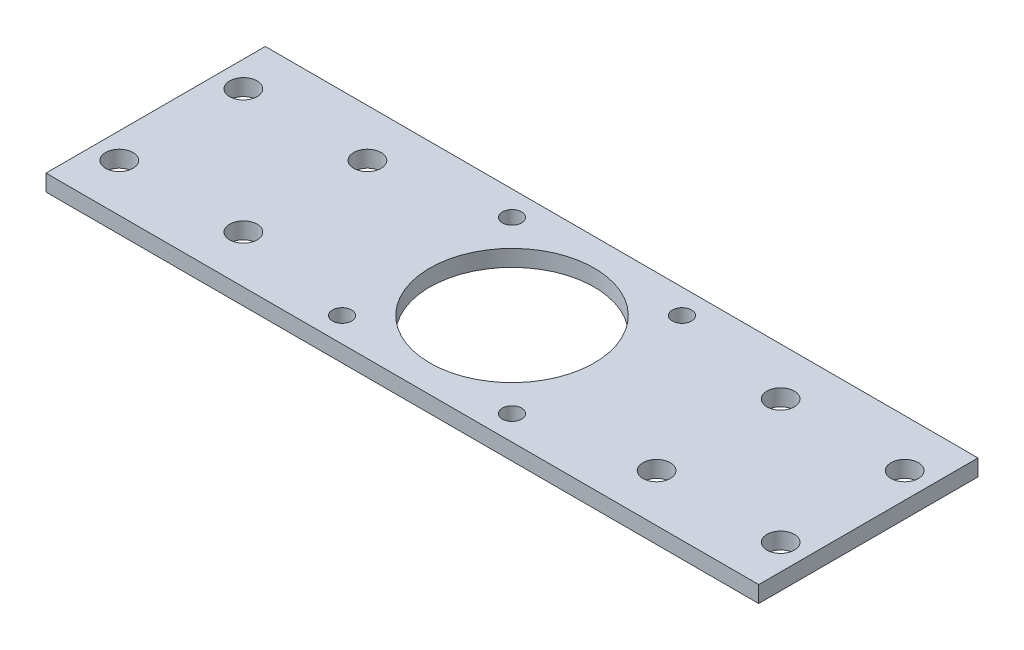
ISO-10303-21;
HEADER;
FILE_DESCRIPTION(('STEP AP214'),'2;1');
FILE_NAME('part.step','',(''),(''),'','','');
FILE_SCHEMA(('AUTOMOTIVE_DESIGN { 1 0 10303 214 1 1 1 1 }'));
ENDSEC;
DATA;
#1=APPLICATION_CONTEXT('core data for automotive mechanical design processes');
#2=APPLICATION_PROTOCOL_DEFINITION('international standard','automotive_design',2000,#1);
#3=PRODUCT_CONTEXT('',#1,'mechanical');
#4=PRODUCT('Part','Part','',(#3));
#5=PRODUCT_RELATED_PRODUCT_CATEGORY('part','',(#4));
#6=PRODUCT_DEFINITION_FORMATION('','',#4);
#7=PRODUCT_DEFINITION_CONTEXT('part definition',#1,'design');
#8=PRODUCT_DEFINITION('design','',#6,#7);
#9=PRODUCT_DEFINITION_SHAPE('','',#8);
#10=(LENGTH_UNIT() NAMED_UNIT(*) SI_UNIT(.MILLI.,.METRE.));
#11=(NAMED_UNIT(*) PLANE_ANGLE_UNIT() SI_UNIT($,.RADIAN.));
#12=(NAMED_UNIT(*) SI_UNIT($,.STERADIAN.) SOLID_ANGLE_UNIT());
#13=UNCERTAINTY_MEASURE_WITH_UNIT(LENGTH_MEASURE(1.E-05),#10,'distance_accuracy_value','');
#14=(GEOMETRIC_REPRESENTATION_CONTEXT(3) GLOBAL_UNCERTAINTY_ASSIGNED_CONTEXT((#13)) GLOBAL_UNIT_ASSIGNED_CONTEXT((#10,
#11,#12)) REPRESENTATION_CONTEXT('',''));
#15=CARTESIAN_POINT('',(0.,0.,0.));
#16=DIRECTION('',(0.,0.,1.));
#17=DIRECTION('',(1.,0.,0.));
#18=AXIS2_PLACEMENT_3D('',#15,#16,#17);
#19=CARTESIAN_POINT('',(65.,3.,-20.));
#20=DIRECTION('',(-1.,0.,0.));
#21=DIRECTION('',(0.,0.,1.));
#22=AXIS2_PLACEMENT_3D('',#19,#20,#21);
#23=PLANE('',#22);
#24=DIRECTION('',(0.,0.,-1.));
#25=VECTOR('',#24,1.);
#26=CARTESIAN_POINT('',(65.,0.,-20.));
#27=LINE('',#26,#25);
#28=CARTESIAN_POINT('',(65.,0.,20.));
#29=VERTEX_POINT('',#28);
#30=CARTESIAN_POINT('',(65.,0.,-20.));
#31=VERTEX_POINT('',#30);
#32=EDGE_CURVE('E96',#29,#31,#27,.T.);
#33=ORIENTED_EDGE('',*,*,#32,.T.);
#34=DIRECTION('',(0.,-1.,0.));
#35=VECTOR('',#34,1.);
#36=CARTESIAN_POINT('',(65.,3.,-20.));
#37=LINE('',#36,#35);
#38=CARTESIAN_POINT('',(65.,3.,-20.));
#39=VERTEX_POINT('',#38);
#40=EDGE_CURVE('E11',#39,#31,#37,.T.);
#41=ORIENTED_EDGE('',*,*,#40,.F.);
#42=DIRECTION('',(0.,0.,-1.));
#43=VECTOR('',#42,1.);
#44=CARTESIAN_POINT('',(65.,3.,-20.));
#45=LINE('',#44,#43);
#46=CARTESIAN_POINT('',(65.,3.,20.));
#47=VERTEX_POINT('',#46);
#48=EDGE_CURVE('E84',#47,#39,#45,.T.);
#49=ORIENTED_EDGE('',*,*,#48,.F.);
#50=DIRECTION('',(0.,-1.,0.));
#51=VECTOR('',#50,1.);
#52=CARTESIAN_POINT('',(65.,3.,20.));
#53=LINE('',#52,#51);
#54=EDGE_CURVE('E92',#47,#29,#53,.T.);
#55=ORIENTED_EDGE('',*,*,#54,.T.);
#56=EDGE_LOOP('',(#33,#41,#49,#55));
#57=FACE_BOUND('',#56,.T.);
#58=ADVANCED_FACE('F33',(#57),#23,.F.);
#59=CARTESIAN_POINT('',(-65.,3.,-20.));
#60=DIRECTION('',(0.,0.,1.));
#61=DIRECTION('',(1.,0.,0.));
#62=AXIS2_PLACEMENT_3D('',#59,#60,#61);
#63=PLANE('',#62);
#64=DIRECTION('',(-1.,0.,0.));
#65=VECTOR('',#64,1.);
#66=CARTESIAN_POINT('',(-65.,0.,-20.));
#67=LINE('',#66,#65);
#68=CARTESIAN_POINT('',(-65.,0.,-20.));
#69=VERTEX_POINT('',#68);
#70=EDGE_CURVE('E88',#31,#69,#67,.T.);
#71=ORIENTED_EDGE('',*,*,#70,.T.);
#72=DIRECTION('',(0.,-1.,0.));
#73=VECTOR('',#72,1.);
#74=CARTESIAN_POINT('',(-65.,3.,-20.));
#75=LINE('',#74,#73);
#76=CARTESIAN_POINT('',(-65.,3.,-20.));
#77=VERTEX_POINT('',#76);
#78=EDGE_CURVE('E41',#77,#69,#75,.T.);
#79=ORIENTED_EDGE('',*,*,#78,.F.);
#80=DIRECTION('',(-1.,0.,0.));
#81=VECTOR('',#80,1.);
#82=CARTESIAN_POINT('',(-65.,3.,-20.));
#83=LINE('',#82,#81);
#84=EDGE_CURVE('E79',#39,#77,#83,.T.);
#85=ORIENTED_EDGE('',*,*,#84,.F.);
#86=ORIENTED_EDGE('',*,*,#40,.T.);
#87=EDGE_LOOP('',(#71,#79,#85,#86));
#88=FACE_BOUND('',#87,.T.);
#89=ADVANCED_FACE('F87',(#88),#63,.F.);
#90=CARTESIAN_POINT('',(-65.,3.,-20.));
#91=DIRECTION('',(1.,0.,0.));
#92=DIRECTION('',(0.,0.,-1.));
#93=AXIS2_PLACEMENT_3D('',#90,#91,#92);
#94=PLANE('',#93);
#95=DIRECTION('',(0.,0.,1.));
#96=VECTOR('',#95,1.);
#97=CARTESIAN_POINT('',(-65.,0.,-20.));
#98=LINE('',#97,#96);
#99=CARTESIAN_POINT('',(-65.,0.,20.));
#100=VERTEX_POINT('',#99);
#101=EDGE_CURVE('E66',#69,#100,#98,.T.);
#102=ORIENTED_EDGE('',*,*,#101,.T.);
#103=DIRECTION('',(0.,-1.,0.));
#104=VECTOR('',#103,1.);
#105=CARTESIAN_POINT('',(-65.,3.,20.));
#106=LINE('',#105,#104);
#107=CARTESIAN_POINT('',(-65.,3.,20.));
#108=VERTEX_POINT('',#107);
#109=EDGE_CURVE('E89',#108,#100,#106,.T.);
#110=ORIENTED_EDGE('',*,*,#109,.F.);
#111=DIRECTION('',(0.,0.,1.));
#112=VECTOR('',#111,1.);
#113=CARTESIAN_POINT('',(-65.,3.,-20.));
#114=LINE('',#113,#112);
#115=EDGE_CURVE('E82',#77,#108,#114,.T.);
#116=ORIENTED_EDGE('',*,*,#115,.F.);
#117=ORIENTED_EDGE('',*,*,#78,.T.);
#118=EDGE_LOOP('',(#102,#110,#116,#117));
#119=FACE_BOUND('',#118,.T.);
#120=ADVANCED_FACE('F90',(#119),#94,.F.);
#121=CARTESIAN_POINT('',(-65.,3.,20.));
#122=DIRECTION('',(0.,0.,-1.));
#123=DIRECTION('',(-1.,0.,0.));
#124=AXIS2_PLACEMENT_3D('',#121,#122,#123);
#125=PLANE('',#124);
#126=DIRECTION('',(1.,0.,0.));
#127=VECTOR('',#126,1.);
#128=CARTESIAN_POINT('',(-65.,0.,20.));
#129=LINE('',#128,#127);
#130=EDGE_CURVE('E72',#100,#29,#129,.T.);
#131=ORIENTED_EDGE('',*,*,#130,.T.);
#132=ORIENTED_EDGE('',*,*,#54,.F.);
#133=DIRECTION('',(1.,0.,0.));
#134=VECTOR('',#133,1.);
#135=CARTESIAN_POINT('',(-65.,3.,20.));
#136=LINE('',#135,#134);
#137=EDGE_CURVE('E49',#108,#47,#136,.T.);
#138=ORIENTED_EDGE('',*,*,#137,.F.);
#139=ORIENTED_EDGE('',*,*,#109,.T.);
#140=EDGE_LOOP('',(#131,#132,#138,#139));
#141=FACE_BOUND('',#140,.T.);
#142=ADVANCED_FACE('F104',(#141),#125,.F.);
#143=CARTESIAN_POINT('',(0.,3.,0.));
#144=DIRECTION('',(0.,1.,0.));
#145=DIRECTION('',(0.,0.,1.));
#146=AXIS2_PLACEMENT_3D('',#143,#144,#145);
#147=PLANE('',#146);
#148=CARTESIAN_POINT('',(15.5,3.,-15.5));
#149=DIRECTION('',(0.,-1.,0.));
#150=DIRECTION('',(0.,0.,-1.));
#151=AXIS2_PLACEMENT_3D('',#148,#149,#150);
#152=CIRCLE('',#151,1.75);
#153=CARTESIAN_POINT('',(15.5,3.,-17.25));
#154=VERTEX_POINT('',#153);
#155=EDGE_CURVE('E181',#154,#154,#152,.T.);
#156=ORIENTED_EDGE('',*,*,#155,.T.);
#157=EDGE_LOOP('',(#156));
#158=FACE_BOUND('',#157,.T.);
#159=CARTESIAN_POINT('',(-15.5,3.,15.5));
#160=DIRECTION('',(0.,-1.,0.));
#161=DIRECTION('',(0.,0.,-1.));
#162=AXIS2_PLACEMENT_3D('',#159,#160,#161);
#163=CIRCLE('',#162,1.75);
#164=CARTESIAN_POINT('',(-15.5,3.,13.75));
#165=VERTEX_POINT('',#164);
#166=EDGE_CURVE('E175',#165,#165,#163,.T.);
#167=ORIENTED_EDGE('',*,*,#166,.T.);
#168=EDGE_LOOP('',(#167));
#169=FACE_BOUND('',#168,.T.);
#170=CARTESIAN_POINT('',(-15.5,3.,-15.5));
#171=DIRECTION('',(0.,-1.,0.));
#172=DIRECTION('',(0.,0.,-1.));
#173=AXIS2_PLACEMENT_3D('',#170,#171,#172);
#174=CIRCLE('',#173,1.75);
#175=CARTESIAN_POINT('',(-15.5,3.,-17.25));
#176=VERTEX_POINT('',#175);
#177=EDGE_CURVE('E169',#176,#176,#174,.T.);
#178=ORIENTED_EDGE('',*,*,#177,.T.);
#179=EDGE_LOOP('',(#178));
#180=FACE_BOUND('',#179,.T.);
#181=CARTESIAN_POINT('',(15.5,3.,15.5));
#182=DIRECTION('',(0.,-1.,0.));
#183=DIRECTION('',(0.,0.,-1.));
#184=AXIS2_PLACEMENT_3D('',#181,#182,#183);
#185=CIRCLE('',#184,1.75);
#186=CARTESIAN_POINT('',(15.5,3.,13.75));
#187=VERTEX_POINT('',#186);
#188=EDGE_CURVE('E163',#187,#187,#185,.T.);
#189=ORIENTED_EDGE('',*,*,#188,.T.);
#190=EDGE_LOOP('',(#189));
#191=FACE_BOUND('',#190,.T.);
#192=CARTESIAN_POINT('',(60.3137084989847,3.,-11.3137084989847));
#193=DIRECTION('',(0.,-1.,0.));
#194=DIRECTION('',(0.,0.,-1.));
#195=AXIS2_PLACEMENT_3D('',#192,#193,#194);
#196=CIRCLE('',#195,2.5);
#197=CARTESIAN_POINT('',(60.3137084989847,3.,-13.8137084989847));
#198=VERTEX_POINT('',#197);
#199=EDGE_CURVE('E157',#198,#198,#196,.T.);
#200=ORIENTED_EDGE('',*,*,#199,.T.);
#201=EDGE_LOOP('',(#200));
#202=FACE_BOUND('',#201,.T.);
#203=CARTESIAN_POINT('',(60.3137084989848,3.,11.3137084989848));
#204=DIRECTION('',(0.,-1.,0.));
#205=DIRECTION('',(0.,0.,-1.));
#206=AXIS2_PLACEMENT_3D('',#203,#204,#205);
#207=CIRCLE('',#206,2.5);
#208=CARTESIAN_POINT('',(60.3137084989848,3.,8.81370849898476));
#209=VERTEX_POINT('',#208);
#210=EDGE_CURVE('E151',#209,#209,#207,.T.);
#211=ORIENTED_EDGE('',*,*,#210,.T.);
#212=EDGE_LOOP('',(#211));
#213=FACE_BOUND('',#212,.T.);
#214=CARTESIAN_POINT('',(37.6862915010152,3.,11.3137084989848));
#215=DIRECTION('',(0.,-1.,0.));
#216=DIRECTION('',(0.,0.,-1.));
#217=AXIS2_PLACEMENT_3D('',#214,#215,#216);
#218=CIRCLE('',#217,2.5);
#219=CARTESIAN_POINT('',(37.6862915010152,3.,8.81370849898476));
#220=VERTEX_POINT('',#219);
#221=EDGE_CURVE('E145',#220,#220,#218,.T.);
#222=ORIENTED_EDGE('',*,*,#221,.T.);
#223=EDGE_LOOP('',(#222));
#224=FACE_BOUND('',#223,.T.);
#225=CARTESIAN_POINT('',(37.6862915010152,3.,-11.3137084989848));
#226=DIRECTION('',(0.,-1.,0.));
#227=DIRECTION('',(0.,0.,-1.));
#228=AXIS2_PLACEMENT_3D('',#225,#226,#227);
#229=CIRCLE('',#228,2.5);
#230=CARTESIAN_POINT('',(37.6862915010152,3.,-13.8137084989848));
#231=VERTEX_POINT('',#230);
#232=EDGE_CURVE('E139',#231,#231,#229,.T.);
#233=ORIENTED_EDGE('',*,*,#232,.T.);
#234=EDGE_LOOP('',(#233));
#235=FACE_BOUND('',#234,.T.);
#236=CARTESIAN_POINT('',(-60.3137084989847,3.,-11.3137084989847));
#237=DIRECTION('',(0.,-1.,0.));
#238=DIRECTION('',(0.,0.,-1.));
#239=AXIS2_PLACEMENT_3D('',#236,#237,#238);
#240=CIRCLE('',#239,2.5);
#241=CARTESIAN_POINT('',(-60.3137084989847,3.,-13.8137084989848));
#242=VERTEX_POINT('',#241);
#243=EDGE_CURVE('E133',#242,#242,#240,.T.);
#244=ORIENTED_EDGE('',*,*,#243,.T.);
#245=EDGE_LOOP('',(#244));
#246=FACE_BOUND('',#245,.T.);
#247=CARTESIAN_POINT('',(-60.3137084989848,3.,11.3137084989848));
#248=DIRECTION('',(0.,-1.,0.));
#249=DIRECTION('',(0.,0.,-1.));
#250=AXIS2_PLACEMENT_3D('',#247,#248,#249);
#251=CIRCLE('',#250,2.5);
#252=CARTESIAN_POINT('',(-60.3137084989848,3.,8.81370849898476));
#253=VERTEX_POINT('',#252);
#254=EDGE_CURVE('E127',#253,#253,#251,.T.);
#255=ORIENTED_EDGE('',*,*,#254,.T.);
#256=EDGE_LOOP('',(#255));
#257=FACE_BOUND('',#256,.T.);
#258=CARTESIAN_POINT('',(-37.6862915010152,3.,11.3137084989848));
#259=DIRECTION('',(0.,-1.,0.));
#260=DIRECTION('',(0.,0.,-1.));
#261=AXIS2_PLACEMENT_3D('',#258,#259,#260);
#262=CIRCLE('',#261,2.5);
#263=CARTESIAN_POINT('',(-37.6862915010152,3.,8.81370849898476));
#264=VERTEX_POINT('',#263);
#265=EDGE_CURVE('E121',#264,#264,#262,.T.);
#266=ORIENTED_EDGE('',*,*,#265,.T.);
#267=EDGE_LOOP('',(#266));
#268=FACE_BOUND('',#267,.T.);
#269=CARTESIAN_POINT('',(-37.6862915010152,3.,-11.3137084989848));
#270=DIRECTION('',(0.,-1.,0.));
#271=DIRECTION('',(0.,0.,-1.));
#272=AXIS2_PLACEMENT_3D('',#269,#270,#271);
#273=CIRCLE('',#272,2.5);
#274=CARTESIAN_POINT('',(-37.6862915010152,3.,-13.8137084989848));
#275=VERTEX_POINT('',#274);
#276=EDGE_CURVE('E113',#275,#275,#273,.T.);
#277=ORIENTED_EDGE('',*,*,#276,.T.);
#278=EDGE_LOOP('',(#277));
#279=FACE_BOUND('',#278,.T.);
#280=CARTESIAN_POINT('',(0.,3.,0.));
#281=DIRECTION('',(0.,1.,0.));
#282=DIRECTION('',(0.,0.,1.));
#283=AXIS2_PLACEMENT_3D('',#280,#281,#282);
#284=CIRCLE('',#283,15.);
#285=CARTESIAN_POINT('',(0.,3.,15.));
#286=VERTEX_POINT('',#285);
#287=EDGE_CURVE('E99',#286,#286,#284,.T.);
#288=ORIENTED_EDGE('',*,*,#287,.F.);
#289=EDGE_LOOP('',(#288));
#290=FACE_BOUND('',#289,.T.);
#291=ORIENTED_EDGE('',*,*,#48,.T.);
#292=ORIENTED_EDGE('',*,*,#84,.T.);
#293=ORIENTED_EDGE('',*,*,#115,.T.);
#294=ORIENTED_EDGE('',*,*,#137,.T.);
#295=EDGE_LOOP('',(#291,#292,#293,#294));
#296=FACE_BOUND('',#295,.T.);
#297=ADVANCED_FACE('F80',(#158,#169,#180,#191,#202,#213,#224,#235,#246,#257,#268,#279,#290,
#296),#147,.T.);
#298=CARTESIAN_POINT('',(0.,0.,0.));
#299=DIRECTION('',(0.,1.,0.));
#300=DIRECTION('',(0.,0.,1.));
#301=AXIS2_PLACEMENT_3D('',#298,#299,#300);
#302=PLANE('',#301);
#303=CARTESIAN_POINT('',(15.5,0.,-15.5));
#304=DIRECTION('',(0.,-1.,0.));
#305=DIRECTION('',(0.,0.,-1.));
#306=AXIS2_PLACEMENT_3D('',#303,#304,#305);
#307=CIRCLE('',#306,1.75);
#308=CARTESIAN_POINT('',(15.5,0.,-17.25));
#309=VERTEX_POINT('',#308);
#310=EDGE_CURVE('E184',#309,#309,#307,.T.);
#311=ORIENTED_EDGE('',*,*,#310,.F.);
#312=EDGE_LOOP('',(#311));
#313=FACE_BOUND('',#312,.T.);
#314=CARTESIAN_POINT('',(-15.5,0.,15.5));
#315=DIRECTION('',(0.,-1.,0.));
#316=DIRECTION('',(0.,0.,-1.));
#317=AXIS2_PLACEMENT_3D('',#314,#315,#316);
#318=CIRCLE('',#317,1.75);
#319=CARTESIAN_POINT('',(-15.5,0.,13.75));
#320=VERTEX_POINT('',#319);
#321=EDGE_CURVE('E178',#320,#320,#318,.T.);
#322=ORIENTED_EDGE('',*,*,#321,.F.);
#323=EDGE_LOOP('',(#322));
#324=FACE_BOUND('',#323,.T.);
#325=CARTESIAN_POINT('',(-15.5,0.,-15.5));
#326=DIRECTION('',(0.,-1.,0.));
#327=DIRECTION('',(0.,0.,-1.));
#328=AXIS2_PLACEMENT_3D('',#325,#326,#327);
#329=CIRCLE('',#328,1.75);
#330=CARTESIAN_POINT('',(-15.5,0.,-17.25));
#331=VERTEX_POINT('',#330);
#332=EDGE_CURVE('E172',#331,#331,#329,.T.);
#333=ORIENTED_EDGE('',*,*,#332,.F.);
#334=EDGE_LOOP('',(#333));
#335=FACE_BOUND('',#334,.T.);
#336=CARTESIAN_POINT('',(15.5,0.,15.5));
#337=DIRECTION('',(0.,-1.,0.));
#338=DIRECTION('',(0.,0.,-1.));
#339=AXIS2_PLACEMENT_3D('',#336,#337,#338);
#340=CIRCLE('',#339,1.75);
#341=CARTESIAN_POINT('',(15.5,0.,13.75));
#342=VERTEX_POINT('',#341);
#343=EDGE_CURVE('E166',#342,#342,#340,.T.);
#344=ORIENTED_EDGE('',*,*,#343,.F.);
#345=EDGE_LOOP('',(#344));
#346=FACE_BOUND('',#345,.T.);
#347=CARTESIAN_POINT('',(60.3137084989847,0.,-11.3137084989847));
#348=DIRECTION('',(0.,-1.,0.));
#349=DIRECTION('',(0.,0.,-1.));
#350=AXIS2_PLACEMENT_3D('',#347,#348,#349);
#351=CIRCLE('',#350,2.5);
#352=CARTESIAN_POINT('',(60.3137084989847,0.,-13.8137084989847));
#353=VERTEX_POINT('',#352);
#354=EDGE_CURVE('E160',#353,#353,#351,.T.);
#355=ORIENTED_EDGE('',*,*,#354,.F.);
#356=EDGE_LOOP('',(#355));
#357=FACE_BOUND('',#356,.T.);
#358=CARTESIAN_POINT('',(60.3137084989848,0.,11.3137084989848));
#359=DIRECTION('',(0.,-1.,0.));
#360=DIRECTION('',(0.,0.,-1.));
#361=AXIS2_PLACEMENT_3D('',#358,#359,#360);
#362=CIRCLE('',#361,2.5);
#363=CARTESIAN_POINT('',(60.3137084989848,0.,8.81370849898476));
#364=VERTEX_POINT('',#363);
#365=EDGE_CURVE('E154',#364,#364,#362,.T.);
#366=ORIENTED_EDGE('',*,*,#365,.F.);
#367=EDGE_LOOP('',(#366));
#368=FACE_BOUND('',#367,.T.);
#369=CARTESIAN_POINT('',(37.6862915010152,0.,11.3137084989848));
#370=DIRECTION('',(0.,-1.,0.));
#371=DIRECTION('',(0.,0.,-1.));
#372=AXIS2_PLACEMENT_3D('',#369,#370,#371);
#373=CIRCLE('',#372,2.5);
#374=CARTESIAN_POINT('',(37.6862915010152,0.,8.81370849898476));
#375=VERTEX_POINT('',#374);
#376=EDGE_CURVE('E148',#375,#375,#373,.T.);
#377=ORIENTED_EDGE('',*,*,#376,.F.);
#378=EDGE_LOOP('',(#377));
#379=FACE_BOUND('',#378,.T.);
#380=CARTESIAN_POINT('',(37.6862915010152,0.,-11.3137084989848));
#381=DIRECTION('',(0.,-1.,0.));
#382=DIRECTION('',(0.,0.,-1.));
#383=AXIS2_PLACEMENT_3D('',#380,#381,#382);
#384=CIRCLE('',#383,2.5);
#385=CARTESIAN_POINT('',(37.6862915010152,0.,-13.8137084989848));
#386=VERTEX_POINT('',#385);
#387=EDGE_CURVE('E142',#386,#386,#384,.T.);
#388=ORIENTED_EDGE('',*,*,#387,.F.);
#389=EDGE_LOOP('',(#388));
#390=FACE_BOUND('',#389,.T.);
#391=CARTESIAN_POINT('',(-60.3137084989847,0.,-11.3137084989847));
#392=DIRECTION('',(0.,-1.,0.));
#393=DIRECTION('',(0.,0.,-1.));
#394=AXIS2_PLACEMENT_3D('',#391,#392,#393);
#395=CIRCLE('',#394,2.5);
#396=CARTESIAN_POINT('',(-60.3137084989847,0.,-13.8137084989848));
#397=VERTEX_POINT('',#396);
#398=EDGE_CURVE('E136',#397,#397,#395,.T.);
#399=ORIENTED_EDGE('',*,*,#398,.F.);
#400=EDGE_LOOP('',(#399));
#401=FACE_BOUND('',#400,.T.);
#402=CARTESIAN_POINT('',(-60.3137084989848,0.,11.3137084989848));
#403=DIRECTION('',(0.,-1.,0.));
#404=DIRECTION('',(0.,0.,-1.));
#405=AXIS2_PLACEMENT_3D('',#402,#403,#404);
#406=CIRCLE('',#405,2.5);
#407=CARTESIAN_POINT('',(-60.3137084989848,0.,8.81370849898476));
#408=VERTEX_POINT('',#407);
#409=EDGE_CURVE('E130',#408,#408,#406,.T.);
#410=ORIENTED_EDGE('',*,*,#409,.F.);
#411=EDGE_LOOP('',(#410));
#412=FACE_BOUND('',#411,.T.);
#413=CARTESIAN_POINT('',(-37.6862915010152,0.,11.3137084989848));
#414=DIRECTION('',(0.,-1.,0.));
#415=DIRECTION('',(0.,0.,-1.));
#416=AXIS2_PLACEMENT_3D('',#413,#414,#415);
#417=CIRCLE('',#416,2.5);
#418=CARTESIAN_POINT('',(-37.6862915010152,0.,8.81370849898476));
#419=VERTEX_POINT('',#418);
#420=EDGE_CURVE('E124',#419,#419,#417,.T.);
#421=ORIENTED_EDGE('',*,*,#420,.F.);
#422=EDGE_LOOP('',(#421));
#423=FACE_BOUND('',#422,.T.);
#424=CARTESIAN_POINT('',(-37.6862915010152,0.,-11.3137084989848));
#425=DIRECTION('',(0.,-1.,0.));
#426=DIRECTION('',(0.,0.,-1.));
#427=AXIS2_PLACEMENT_3D('',#424,#425,#426);
#428=CIRCLE('',#427,2.5);
#429=CARTESIAN_POINT('',(-37.6862915010152,0.,-13.8137084989848));
#430=VERTEX_POINT('',#429);
#431=EDGE_CURVE('E118',#430,#430,#428,.T.);
#432=ORIENTED_EDGE('',*,*,#431,.F.);
#433=EDGE_LOOP('',(#432));
#434=FACE_BOUND('',#433,.T.);
#435=CARTESIAN_POINT('',(0.,0.,0.));
#436=DIRECTION('',(0.,1.,0.));
#437=DIRECTION('',(0.,0.,1.));
#438=AXIS2_PLACEMENT_3D('',#435,#436,#437);
#439=CIRCLE('',#438,15.);
#440=CARTESIAN_POINT('',(0.,0.,15.));
#441=VERTEX_POINT('',#440);
#442=EDGE_CURVE('E110',#441,#441,#439,.T.);
#443=ORIENTED_EDGE('',*,*,#442,.T.);
#444=EDGE_LOOP('',(#443));
#445=FACE_BOUND('',#444,.T.);
#446=ORIENTED_EDGE('',*,*,#32,.F.);
#447=ORIENTED_EDGE('',*,*,#130,.F.);
#448=ORIENTED_EDGE('',*,*,#101,.F.);
#449=ORIENTED_EDGE('',*,*,#70,.F.);
#450=EDGE_LOOP('',(#446,#447,#448,#449));
#451=FACE_BOUND('',#450,.T.);
#452=ADVANCED_FACE('F107',(#313,#324,#335,#346,#357,#368,#379,#390,#401,#412,#423,#434,#445,
#451),#302,.F.);
#453=CARTESIAN_POINT('',(0.,3.,0.));
#454=DIRECTION('',(0.,-1.,0.));
#455=DIRECTION('',(0.,0.,-1.));
#456=AXIS2_PLACEMENT_3D('',#453,#454,#455);
#457=CYLINDRICAL_SURFACE('',#456,15.);
#458=ORIENTED_EDGE('',*,*,#287,.T.);
#459=EDGE_LOOP('',(#458));
#460=FACE_BOUND('',#459,.T.);
#461=ORIENTED_EDGE('',*,*,#442,.F.);
#462=EDGE_LOOP('',(#461));
#463=FACE_BOUND('',#462,.T.);
#464=ADVANCED_FACE('F192',(#460,#463),#457,.F.);
#465=CARTESIAN_POINT('',(-37.6862915010152,0.,-11.3137084989848));
#466=DIRECTION('',(0.,-1.,0.));
#467=DIRECTION('',(0.,0.,-1.));
#468=AXIS2_PLACEMENT_3D('',#465,#466,#467);
#469=CYLINDRICAL_SURFACE('',#468,2.5);
#470=ORIENTED_EDGE('',*,*,#276,.F.);
#471=EDGE_LOOP('',(#470));
#472=FACE_BOUND('',#471,.T.);
#473=ORIENTED_EDGE('',*,*,#431,.T.);
#474=EDGE_LOOP('',(#473));
#475=FACE_BOUND('',#474,.T.);
#476=ADVANCED_FACE('F219',(#472,#475),#469,.F.);
#477=CARTESIAN_POINT('',(-37.6862915010152,0.,11.3137084989848));
#478=DIRECTION('',(0.,-1.,0.));
#479=DIRECTION('',(0.,0.,-1.));
#480=AXIS2_PLACEMENT_3D('',#477,#478,#479);
#481=CYLINDRICAL_SURFACE('',#480,2.5);
#482=ORIENTED_EDGE('',*,*,#265,.F.);
#483=EDGE_LOOP('',(#482));
#484=FACE_BOUND('',#483,.T.);
#485=ORIENTED_EDGE('',*,*,#420,.T.);
#486=EDGE_LOOP('',(#485));
#487=FACE_BOUND('',#486,.T.);
#488=ADVANCED_FACE('F225',(#484,#487),#481,.F.);
#489=CARTESIAN_POINT('',(-60.3137084989848,0.,11.3137084989848));
#490=DIRECTION('',(0.,-1.,0.));
#491=DIRECTION('',(0.,0.,-1.));
#492=AXIS2_PLACEMENT_3D('',#489,#490,#491);
#493=CYLINDRICAL_SURFACE('',#492,2.5);
#494=ORIENTED_EDGE('',*,*,#254,.F.);
#495=EDGE_LOOP('',(#494));
#496=FACE_BOUND('',#495,.T.);
#497=ORIENTED_EDGE('',*,*,#409,.T.);
#498=EDGE_LOOP('',(#497));
#499=FACE_BOUND('',#498,.T.);
#500=ADVANCED_FACE('F272',(#496,#499),#493,.F.);
#501=CARTESIAN_POINT('',(-60.3137084989847,0.,-11.3137084989847));
#502=DIRECTION('',(0.,-1.,0.));
#503=DIRECTION('',(0.,0.,-1.));
#504=AXIS2_PLACEMENT_3D('',#501,#502,#503);
#505=CYLINDRICAL_SURFACE('',#504,2.5);
#506=ORIENTED_EDGE('',*,*,#243,.F.);
#507=EDGE_LOOP('',(#506));
#508=FACE_BOUND('',#507,.T.);
#509=ORIENTED_EDGE('',*,*,#398,.T.);
#510=EDGE_LOOP('',(#509));
#511=FACE_BOUND('',#510,.T.);
#512=ADVANCED_FACE('F277',(#508,#511),#505,.F.);
#513=CARTESIAN_POINT('',(37.6862915010152,0.,-11.3137084989848));
#514=DIRECTION('',(0.,-1.,0.));
#515=DIRECTION('',(0.,0.,-1.));
#516=AXIS2_PLACEMENT_3D('',#513,#514,#515);
#517=CYLINDRICAL_SURFACE('',#516,2.5);
#518=ORIENTED_EDGE('',*,*,#232,.F.);
#519=EDGE_LOOP('',(#518));
#520=FACE_BOUND('',#519,.T.);
#521=ORIENTED_EDGE('',*,*,#387,.T.);
#522=EDGE_LOOP('',(#521));
#523=FACE_BOUND('',#522,.T.);
#524=ADVANCED_FACE('F283',(#520,#523),#517,.F.);
#525=CARTESIAN_POINT('',(37.6862915010152,0.,11.3137084989848));
#526=DIRECTION('',(0.,-1.,0.));
#527=DIRECTION('',(0.,0.,-1.));
#528=AXIS2_PLACEMENT_3D('',#525,#526,#527);
#529=CYLINDRICAL_SURFACE('',#528,2.5);
#530=ORIENTED_EDGE('',*,*,#221,.F.);
#531=EDGE_LOOP('',(#530));
#532=FACE_BOUND('',#531,.T.);
#533=ORIENTED_EDGE('',*,*,#376,.T.);
#534=EDGE_LOOP('',(#533));
#535=FACE_BOUND('',#534,.T.);
#536=ADVANCED_FACE('F287',(#532,#535),#529,.F.);
#537=CARTESIAN_POINT('',(60.3137084989848,0.,11.3137084989848));
#538=DIRECTION('',(0.,-1.,0.));
#539=DIRECTION('',(0.,0.,-1.));
#540=AXIS2_PLACEMENT_3D('',#537,#538,#539);
#541=CYLINDRICAL_SURFACE('',#540,2.5);
#542=ORIENTED_EDGE('',*,*,#210,.F.);
#543=EDGE_LOOP('',(#542));
#544=FACE_BOUND('',#543,.T.);
#545=ORIENTED_EDGE('',*,*,#365,.T.);
#546=EDGE_LOOP('',(#545));
#547=FACE_BOUND('',#546,.T.);
#548=ADVANCED_FACE('F291',(#544,#547),#541,.F.);
#549=CARTESIAN_POINT('',(60.3137084989847,0.,-11.3137084989847));
#550=DIRECTION('',(0.,-1.,0.));
#551=DIRECTION('',(0.,0.,-1.));
#552=AXIS2_PLACEMENT_3D('',#549,#550,#551);
#553=CYLINDRICAL_SURFACE('',#552,2.5);
#554=ORIENTED_EDGE('',*,*,#199,.F.);
#555=EDGE_LOOP('',(#554));
#556=FACE_BOUND('',#555,.T.);
#557=ORIENTED_EDGE('',*,*,#354,.T.);
#558=EDGE_LOOP('',(#557));
#559=FACE_BOUND('',#558,.T.);
#560=ADVANCED_FACE('F295',(#556,#559),#553,.F.);
#561=CARTESIAN_POINT('',(15.5,0.,15.5));
#562=DIRECTION('',(0.,-1.,0.));
#563=DIRECTION('',(0.,0.,-1.));
#564=AXIS2_PLACEMENT_3D('',#561,#562,#563);
#565=CYLINDRICAL_SURFACE('',#564,1.75);
#566=ORIENTED_EDGE('',*,*,#188,.F.);
#567=EDGE_LOOP('',(#566));
#568=FACE_BOUND('',#567,.T.);
#569=ORIENTED_EDGE('',*,*,#343,.T.);
#570=EDGE_LOOP('',(#569));
#571=FACE_BOUND('',#570,.T.);
#572=ADVANCED_FACE('F299',(#568,#571),#565,.F.);
#573=CARTESIAN_POINT('',(-15.5,0.,-15.5));
#574=DIRECTION('',(0.,-1.,0.));
#575=DIRECTION('',(0.,0.,-1.));
#576=AXIS2_PLACEMENT_3D('',#573,#574,#575);
#577=CYLINDRICAL_SURFACE('',#576,1.75);
#578=ORIENTED_EDGE('',*,*,#177,.F.);
#579=EDGE_LOOP('',(#578));
#580=FACE_BOUND('',#579,.T.);
#581=ORIENTED_EDGE('',*,*,#332,.T.);
#582=EDGE_LOOP('',(#581));
#583=FACE_BOUND('',#582,.T.);
#584=ADVANCED_FACE('F303',(#580,#583),#577,.F.);
#585=CARTESIAN_POINT('',(-15.5,0.,15.5));
#586=DIRECTION('',(0.,-1.,0.));
#587=DIRECTION('',(0.,0.,-1.));
#588=AXIS2_PLACEMENT_3D('',#585,#586,#587);
#589=CYLINDRICAL_SURFACE('',#588,1.75);
#590=ORIENTED_EDGE('',*,*,#166,.F.);
#591=EDGE_LOOP('',(#590));
#592=FACE_BOUND('',#591,.T.);
#593=ORIENTED_EDGE('',*,*,#321,.T.);
#594=EDGE_LOOP('',(#593));
#595=FACE_BOUND('',#594,.T.);
#596=ADVANCED_FACE('F307',(#592,#595),#589,.F.);
#597=CARTESIAN_POINT('',(15.5,0.,-15.5));
#598=DIRECTION('',(0.,-1.,0.));
#599=DIRECTION('',(0.,0.,-1.));
#600=AXIS2_PLACEMENT_3D('',#597,#598,#599);
#601=CYLINDRICAL_SURFACE('',#600,1.75);
#602=ORIENTED_EDGE('',*,*,#155,.F.);
#603=EDGE_LOOP('',(#602));
#604=FACE_BOUND('',#603,.T.);
#605=ORIENTED_EDGE('',*,*,#310,.T.);
#606=EDGE_LOOP('',(#605));
#607=FACE_BOUND('',#606,.T.);
#608=ADVANCED_FACE('F188',(#604,#607),#601,.F.);
#609=CLOSED_SHELL('',(#58,#89,#120,#142,#297,#452,#464,#476,#488,#500,#512,#524,#536,#548,#560,
#572,#584,#596,#608));
#610=MANIFOLD_SOLID_BREP('B2',#609);
#611=ADVANCED_BREP_SHAPE_REPRESENTATION('',(#18,#610),#14);
#612=SHAPE_DEFINITION_REPRESENTATION(#9,#611);
ENDSEC;
END-ISO-10303-21;
